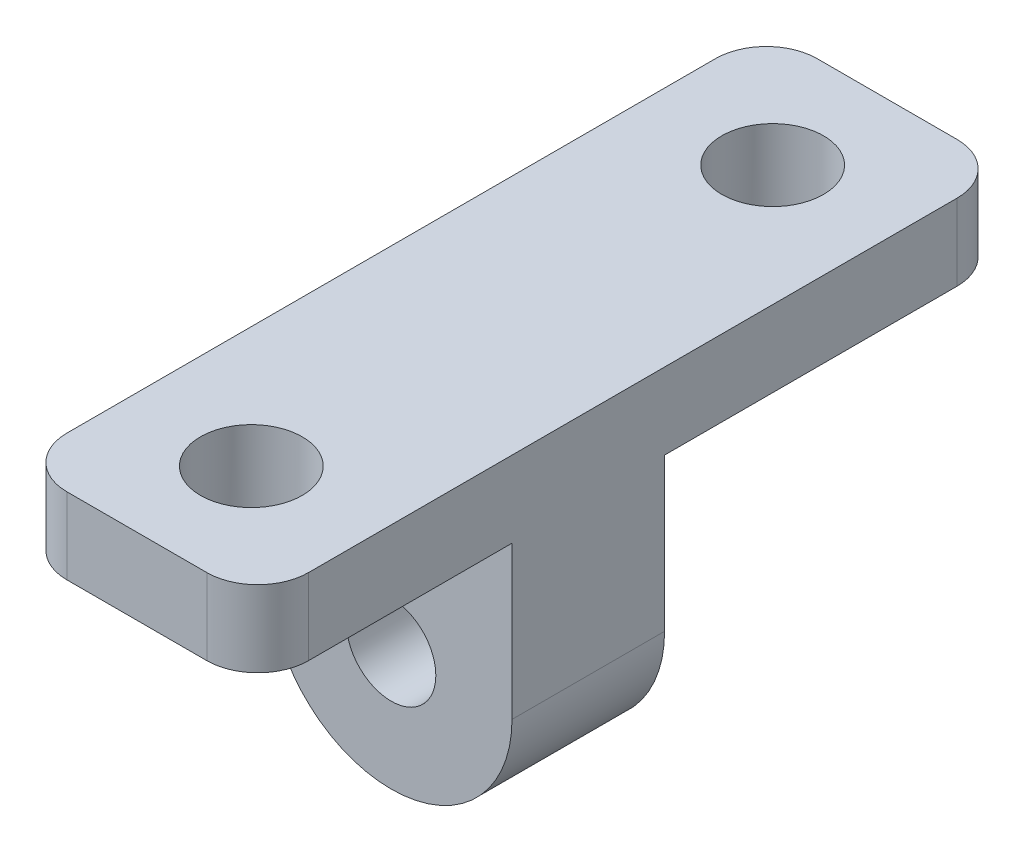
ISO-10303-21;
HEADER;
FILE_DESCRIPTION(('STEP AP214'),'2;1');
FILE_NAME('part.step','',(''),(''),'','','');
FILE_SCHEMA(('AUTOMOTIVE_DESIGN { 1 0 10303 214 1 1 1 1 }'));
ENDSEC;
DATA;
#1=APPLICATION_CONTEXT('core data for automotive mechanical design processes');
#2=APPLICATION_PROTOCOL_DEFINITION('international standard','automotive_design',2000,#1);
#3=PRODUCT_CONTEXT('',#1,'mechanical');
#4=PRODUCT('Part','Part','',(#3));
#5=PRODUCT_RELATED_PRODUCT_CATEGORY('part','',(#4));
#6=PRODUCT_DEFINITION_FORMATION('','',#4);
#7=PRODUCT_DEFINITION_CONTEXT('part definition',#1,'design');
#8=PRODUCT_DEFINITION('design','',#6,#7);
#9=PRODUCT_DEFINITION_SHAPE('','',#8);
#10=(LENGTH_UNIT() NAMED_UNIT(*) SI_UNIT(.MILLI.,.METRE.));
#11=(NAMED_UNIT(*) PLANE_ANGLE_UNIT() SI_UNIT($,.RADIAN.));
#12=(NAMED_UNIT(*) SI_UNIT($,.STERADIAN.) SOLID_ANGLE_UNIT());
#13=UNCERTAINTY_MEASURE_WITH_UNIT(LENGTH_MEASURE(1.E-05),#10,'distance_accuracy_value','');
#14=(GEOMETRIC_REPRESENTATION_CONTEXT(3) GLOBAL_UNCERTAINTY_ASSIGNED_CONTEXT((#13)) GLOBAL_UNIT_ASSIGNED_CONTEXT((#10,
#11,#12)) REPRESENTATION_CONTEXT('',''));
#15=CARTESIAN_POINT('',(0.,0.,0.));
#16=DIRECTION('',(0.,0.,1.));
#17=DIRECTION('',(1.,0.,0.));
#18=AXIS2_PLACEMENT_3D('',#15,#16,#17);
#19=CARTESIAN_POINT('',(0.,0.,6.));
#20=DIRECTION('',(0.,0.,-1.));
#21=DIRECTION('',(-1.,0.,0.));
#22=AXIS2_PLACEMENT_3D('',#19,#20,#21);
#23=CYLINDRICAL_SURFACE('',#22,4.75);
#24=CARTESIAN_POINT('',(0.,0.,0.));
#25=DIRECTION('',(0.,0.,1.));
#26=DIRECTION('',(1.,0.,0.));
#27=AXIS2_PLACEMENT_3D('',#24,#25,#26);
#28=CIRCLE('',#27,4.75);
#29=CARTESIAN_POINT('',(-4.75,0.,0.));
#30=VERTEX_POINT('',#29);
#31=CARTESIAN_POINT('',(4.75,0.,0.));
#32=VERTEX_POINT('',#31);
#33=EDGE_CURVE('E194',#30,#32,#28,.T.);
#34=ORIENTED_EDGE('',*,*,#33,.T.);
#35=DIRECTION('',(0.,0.,-1.));
#36=VECTOR('',#35,1.);
#37=CARTESIAN_POINT('',(4.75,0.,6.));
#38=LINE('',#37,#36);
#39=CARTESIAN_POINT('',(4.75,0.,6.));
#40=VERTEX_POINT('',#39);
#41=EDGE_CURVE('E212',#40,#32,#38,.T.);
#42=ORIENTED_EDGE('',*,*,#41,.F.);
#43=CARTESIAN_POINT('',(0.,0.,6.));
#44=DIRECTION('',(0.,0.,1.));
#45=DIRECTION('',(1.,0.,0.));
#46=AXIS2_PLACEMENT_3D('',#43,#44,#45);
#47=CIRCLE('',#46,4.75);
#48=CARTESIAN_POINT('',(-4.75,0.,6.));
#49=VERTEX_POINT('',#48);
#50=EDGE_CURVE('E142',#49,#40,#47,.T.);
#51=ORIENTED_EDGE('',*,*,#50,.F.);
#52=DIRECTION('',(0.,0.,-1.));
#53=VECTOR('',#52,1.);
#54=CARTESIAN_POINT('',(-4.75,0.,6.));
#55=LINE('',#54,#53);
#56=EDGE_CURVE('E189',#49,#30,#55,.T.);
#57=ORIENTED_EDGE('',*,*,#56,.T.);
#58=EDGE_LOOP('',(#34,#42,#51,#57));
#59=FACE_BOUND('',#58,.T.);
#60=ADVANCED_FACE('F47',(#59),#23,.T.);
#61=CARTESIAN_POINT('',(4.75,0.,6.));
#62=DIRECTION('',(1.,0.,0.));
#63=DIRECTION('',(0.,0.,-1.));
#64=AXIS2_PLACEMENT_3D('',#61,#62,#63);
#65=PLANE('',#64);
#66=DIRECTION('',(0.,0.,1.));
#67=VECTOR('',#66,1.);
#68=CARTESIAN_POINT('',(4.75,6.,-13.5));
#69=LINE('',#68,#67);
#70=CARTESIAN_POINT('',(4.75,6.,-11.5));
#71=VERTEX_POINT('',#70);
#72=CARTESIAN_POINT('',(4.75,6.,0.));
#73=VERTEX_POINT('',#72);
#74=EDGE_CURVE('E163',#71,#73,#69,.T.);
#75=ORIENTED_EDGE('',*,*,#74,.F.);
#76=DIRECTION('',(0.,-1.,0.));
#77=VECTOR('',#76,1.);
#78=CARTESIAN_POINT('',(4.75,0.,-11.5));
#79=LINE('',#78,#77);
#80=CARTESIAN_POINT('',(4.75,9.,-11.5));
#81=VERTEX_POINT('',#80);
#82=EDGE_CURVE('E235',#71,#81,#79,.F.);
#83=ORIENTED_EDGE('',*,*,#82,.T.);
#84=DIRECTION('',(0.,0.,1.));
#85=VECTOR('',#84,1.);
#86=CARTESIAN_POINT('',(4.75,9.,-13.5));
#87=LINE('',#86,#85);
#88=CARTESIAN_POINT('',(4.75,9.,14.));
#89=VERTEX_POINT('',#88);
#90=EDGE_CURVE('E269',#81,#89,#87,.T.);
#91=ORIENTED_EDGE('',*,*,#90,.T.);
#92=DIRECTION('',(0.,-1.,0.));
#93=VECTOR('',#92,1.);
#94=CARTESIAN_POINT('',(4.75,6.,14.));
#95=LINE('',#94,#93);
#96=CARTESIAN_POINT('',(4.75,6.,14.));
#97=VERTEX_POINT('',#96);
#98=EDGE_CURVE('E161',#89,#97,#95,.T.);
#99=ORIENTED_EDGE('',*,*,#98,.T.);
#100=CARTESIAN_POINT('',(4.75,6.,6.));
#101=VERTEX_POINT('',#100);
#102=EDGE_CURVE('E150',#101,#97,#69,.T.);
#103=ORIENTED_EDGE('',*,*,#102,.F.);
#104=DIRECTION('',(0.,-1.,0.));
#105=VECTOR('',#104,1.);
#106=CARTESIAN_POINT('',(4.75,0.,6.));
#107=LINE('',#106,#105);
#108=EDGE_CURVE('E135',#101,#40,#107,.T.);
#109=ORIENTED_EDGE('',*,*,#108,.T.);
#110=ORIENTED_EDGE('',*,*,#41,.T.);
#111=DIRECTION('',(0.,-1.,0.));
#112=VECTOR('',#111,1.);
#113=CARTESIAN_POINT('',(4.75,0.,0.));
#114=LINE('',#113,#112);
#115=EDGE_CURVE('E199',#73,#32,#114,.T.);
#116=ORIENTED_EDGE('',*,*,#115,.F.);
#117=EDGE_LOOP('',(#75,#83,#91,#99,#103,#109,#110,#116));
#118=FACE_BOUND('',#117,.T.);
#119=ADVANCED_FACE('F158',(#118),#65,.T.);
#120=CARTESIAN_POINT('',(0.,0.,6.));
#121=DIRECTION('',(0.,0.,-1.));
#122=DIRECTION('',(-1.,0.,0.));
#123=AXIS2_PLACEMENT_3D('',#120,#121,#122);
#124=CYLINDRICAL_SURFACE('',#123,1.755);
#125=CARTESIAN_POINT('',(0.,0.,6.));
#126=DIRECTION('',(0.,0.,1.));
#127=DIRECTION('',(1.,0.,0.));
#128=AXIS2_PLACEMENT_3D('',#125,#126,#127);
#129=CIRCLE('',#128,1.755);
#130=CARTESIAN_POINT('',(1.755,0.,6.));
#131=VERTEX_POINT('',#130);
#132=EDGE_CURVE('E180',#131,#131,#129,.T.);
#133=ORIENTED_EDGE('',*,*,#132,.T.);
#134=EDGE_LOOP('',(#133));
#135=FACE_BOUND('',#134,.T.);
#136=CARTESIAN_POINT('',(0.,0.,0.));
#137=DIRECTION('',(0.,0.,1.));
#138=DIRECTION('',(1.,0.,0.));
#139=AXIS2_PLACEMENT_3D('',#136,#137,#138);
#140=CIRCLE('',#139,1.755);
#141=CARTESIAN_POINT('',(1.755,0.,0.));
#142=VERTEX_POINT('',#141);
#143=EDGE_CURVE('E190',#142,#142,#140,.T.);
#144=ORIENTED_EDGE('',*,*,#143,.F.);
#145=EDGE_LOOP('',(#144));
#146=FACE_BOUND('',#145,.T.);
#147=ADVANCED_FACE('F320',(#135,#146),#124,.F.);
#148=CARTESIAN_POINT('',(-4.75,0.,6.));
#149=DIRECTION('',(-1.,0.,0.));
#150=DIRECTION('',(0.,0.,1.));
#151=AXIS2_PLACEMENT_3D('',#148,#149,#150);
#152=PLANE('',#151);
#153=DIRECTION('',(0.,0.,1.));
#154=VECTOR('',#153,1.);
#155=CARTESIAN_POINT('',(-4.75,9.,-13.5));
#156=LINE('',#155,#154);
#157=CARTESIAN_POINT('',(-4.75,9.,-11.5));
#158=VERTEX_POINT('',#157);
#159=CARTESIAN_POINT('',(-4.75,9.,14.));
#160=VERTEX_POINT('',#159);
#161=EDGE_CURVE('E195',#158,#160,#156,.T.);
#162=ORIENTED_EDGE('',*,*,#161,.F.);
#163=DIRECTION('',(0.,-1.,0.));
#164=VECTOR('',#163,1.);
#165=CARTESIAN_POINT('',(-4.75,0.,-11.5));
#166=LINE('',#165,#164);
#167=CARTESIAN_POINT('',(-4.75,6.,-11.5));
#168=VERTEX_POINT('',#167);
#169=EDGE_CURVE('E253',#158,#168,#166,.T.);
#170=ORIENTED_EDGE('',*,*,#169,.T.);
#171=DIRECTION('',(0.,0.,1.));
#172=VECTOR('',#171,1.);
#173=CARTESIAN_POINT('',(-4.75,6.,-13.5));
#174=LINE('',#173,#172);
#175=CARTESIAN_POINT('',(-4.75,6.,0.));
#176=VERTEX_POINT('',#175);
#177=EDGE_CURVE('E176',#168,#176,#174,.T.);
#178=ORIENTED_EDGE('',*,*,#177,.T.);
#179=DIRECTION('',(0.,1.,0.));
#180=VECTOR('',#179,1.);
#181=CARTESIAN_POINT('',(-4.75,0.,0.));
#182=LINE('',#181,#180);
#183=EDGE_CURVE('E184',#30,#176,#182,.T.);
#184=ORIENTED_EDGE('',*,*,#183,.F.);
#185=ORIENTED_EDGE('',*,*,#56,.F.);
#186=DIRECTION('',(0.,1.,0.));
#187=VECTOR('',#186,1.);
#188=CARTESIAN_POINT('',(-4.75,0.,6.));
#189=LINE('',#188,#187);
#190=CARTESIAN_POINT('',(-4.75,6.,6.));
#191=VERTEX_POINT('',#190);
#192=EDGE_CURVE('E154',#49,#191,#189,.T.);
#193=ORIENTED_EDGE('',*,*,#192,.T.);
#194=CARTESIAN_POINT('',(-4.75,6.,14.));
#195=VERTEX_POINT('',#194);
#196=EDGE_CURVE('E152',#191,#195,#174,.T.);
#197=ORIENTED_EDGE('',*,*,#196,.T.);
#198=DIRECTION('',(0.,-1.,0.));
#199=VECTOR('',#198,1.);
#200=CARTESIAN_POINT('',(-4.75,9.,14.));
#201=LINE('',#200,#199);
#202=EDGE_CURVE('E250',#195,#160,#201,.F.);
#203=ORIENTED_EDGE('',*,*,#202,.T.);
#204=EDGE_LOOP('',(#162,#170,#178,#184,#185,#193,#197,#203));
#205=FACE_BOUND('',#204,.T.);
#206=ADVANCED_FACE('F278',(#205),#152,.T.);
#207=CARTESIAN_POINT('',(0.,0.,6.));
#208=DIRECTION('',(0.,0.,1.));
#209=DIRECTION('',(1.,0.,0.));
#210=AXIS2_PLACEMENT_3D('',#207,#208,#209);
#211=PLANE('',#210);
#212=ORIENTED_EDGE('',*,*,#132,.F.);
#213=EDGE_LOOP('',(#212));
#214=FACE_BOUND('',#213,.T.);
#215=ORIENTED_EDGE('',*,*,#50,.T.);
#216=ORIENTED_EDGE('',*,*,#108,.F.);
#217=DIRECTION('',(1.,0.,0.));
#218=VECTOR('',#217,1.);
#219=CARTESIAN_POINT('',(0.,6.,6.));
#220=LINE('',#219,#218);
#221=EDGE_CURVE('E139',#191,#101,#220,.T.);
#222=ORIENTED_EDGE('',*,*,#221,.F.);
#223=ORIENTED_EDGE('',*,*,#192,.F.);
#224=EDGE_LOOP('',(#215,#216,#222,#223));
#225=FACE_BOUND('',#224,.T.);
#226=ADVANCED_FACE('F137',(#214,#225),#211,.T.);
#227=CARTESIAN_POINT('',(0.,0.,0.));
#228=DIRECTION('',(0.,0.,1.));
#229=DIRECTION('',(1.,0.,0.));
#230=AXIS2_PLACEMENT_3D('',#227,#228,#229);
#231=PLANE('',#230);
#232=ORIENTED_EDGE('',*,*,#143,.T.);
#233=EDGE_LOOP('',(#232));
#234=FACE_BOUND('',#233,.T.);
#235=ORIENTED_EDGE('',*,*,#33,.F.);
#236=ORIENTED_EDGE('',*,*,#183,.T.);
#237=DIRECTION('',(1.,0.,0.));
#238=VECTOR('',#237,1.);
#239=CARTESIAN_POINT('',(0.,6.,0.));
#240=LINE('',#239,#238);
#241=EDGE_CURVE('E203',#176,#73,#240,.T.);
#242=ORIENTED_EDGE('',*,*,#241,.T.);
#243=ORIENTED_EDGE('',*,*,#115,.T.);
#244=EDGE_LOOP('',(#235,#236,#242,#243));
#245=FACE_BOUND('',#244,.T.);
#246=ADVANCED_FACE('F312',(#234,#245),#231,.F.);
#247=CARTESIAN_POINT('',(0.,6.,0.));
#248=DIRECTION('',(0.,-1.,0.));
#249=DIRECTION('',(0.,0.,-1.));
#250=AXIS2_PLACEMENT_3D('',#247,#248,#249);
#251=PLANE('',#250);
#252=CARTESIAN_POINT('',(0.,6.,-9.));
#253=DIRECTION('',(0.,-1.,0.));
#254=DIRECTION('',(0.,0.,-1.));
#255=AXIS2_PLACEMENT_3D('',#252,#253,#254);
#256=CIRCLE('',#255,2.);
#257=CARTESIAN_POINT('',(0.,6.,-11.));
#258=VERTEX_POINT('',#257);
#259=EDGE_CURVE('E170',#258,#258,#256,.T.);
#260=ORIENTED_EDGE('',*,*,#259,.F.);
#261=EDGE_LOOP('',(#260));
#262=FACE_BOUND('',#261,.T.);
#263=DIRECTION('',(1.,0.,0.));
#264=VECTOR('',#263,1.);
#265=CARTESIAN_POINT('',(-4.75,6.,-13.5));
#266=LINE('',#265,#264);
#267=CARTESIAN_POINT('',(-2.75,6.,-13.5));
#268=VERTEX_POINT('',#267);
#269=CARTESIAN_POINT('',(2.75,6.,-13.5));
#270=VERTEX_POINT('',#269);
#271=EDGE_CURVE('E164',#268,#270,#266,.T.);
#272=ORIENTED_EDGE('',*,*,#271,.T.);
#273=CARTESIAN_POINT('',(2.75,6.,-11.5));
#274=DIRECTION('',(0.,-1.,0.));
#275=DIRECTION('',(0.,0.,-1.));
#276=AXIS2_PLACEMENT_3D('',#273,#274,#275);
#277=CIRCLE('',#276,2.);
#278=EDGE_CURVE('E230',#270,#71,#277,.T.);
#279=ORIENTED_EDGE('',*,*,#278,.T.);
#280=ORIENTED_EDGE('',*,*,#74,.T.);
#281=ORIENTED_EDGE('',*,*,#241,.F.);
#282=ORIENTED_EDGE('',*,*,#177,.F.);
#283=CARTESIAN_POINT('',(-2.75,6.,-11.5));
#284=DIRECTION('',(0.,-1.,0.));
#285=DIRECTION('',(0.,0.,-1.));
#286=AXIS2_PLACEMENT_3D('',#283,#284,#285);
#287=CIRCLE('',#286,2.);
#288=EDGE_CURVE('E227',#168,#268,#287,.T.);
#289=ORIENTED_EDGE('',*,*,#288,.T.);
#290=EDGE_LOOP('',(#272,#279,#280,#281,#282,#289));
#291=FACE_BOUND('',#290,.T.);
#292=ADVANCED_FACE('F309',(#262,#291),#251,.T.);
#293=CARTESIAN_POINT('',(-4.75,9.,-13.5));
#294=DIRECTION('',(0.,0.,-1.));
#295=DIRECTION('',(-1.,0.,0.));
#296=AXIS2_PLACEMENT_3D('',#293,#294,#295);
#297=PLANE('',#296);
#298=DIRECTION('',(1.,0.,0.));
#299=VECTOR('',#298,1.);
#300=CARTESIAN_POINT('',(-4.75,9.,-13.5));
#301=LINE('',#300,#299);
#302=CARTESIAN_POINT('',(-2.75,9.,-13.5));
#303=VERTEX_POINT('',#302);
#304=CARTESIAN_POINT('',(2.75,9.,-13.5));
#305=VERTEX_POINT('',#304);
#306=EDGE_CURVE('E179',#303,#305,#301,.T.);
#307=ORIENTED_EDGE('',*,*,#306,.T.);
#308=DIRECTION('',(0.,-1.,0.));
#309=VECTOR('',#308,1.);
#310=CARTESIAN_POINT('',(2.75,9.,-13.5));
#311=LINE('',#310,#309);
#312=EDGE_CURVE('E223',#305,#270,#311,.T.);
#313=ORIENTED_EDGE('',*,*,#312,.T.);
#314=ORIENTED_EDGE('',*,*,#271,.F.);
#315=DIRECTION('',(0.,-1.,0.));
#316=VECTOR('',#315,1.);
#317=CARTESIAN_POINT('',(-2.75,9.,-13.5));
#318=LINE('',#317,#316);
#319=EDGE_CURVE('E215',#268,#303,#318,.F.);
#320=ORIENTED_EDGE('',*,*,#319,.T.);
#321=EDGE_LOOP('',(#307,#313,#314,#320));
#322=FACE_BOUND('',#321,.T.);
#323=ADVANCED_FACE('F299',(#322),#297,.T.);
#324=CARTESIAN_POINT('',(-4.75,9.,16.));
#325=DIRECTION('',(0.,0.,-1.));
#326=DIRECTION('',(-1.,0.,0.));
#327=AXIS2_PLACEMENT_3D('',#324,#325,#326);
#328=PLANE('',#327);
#329=DIRECTION('',(1.,0.,0.));
#330=VECTOR('',#329,1.);
#331=CARTESIAN_POINT('',(-4.75,9.,16.));
#332=LINE('',#331,#330);
#333=CARTESIAN_POINT('',(-2.75,9.,16.));
#334=VERTEX_POINT('',#333);
#335=CARTESIAN_POINT('',(2.75,9.,16.));
#336=VERTEX_POINT('',#335);
#337=EDGE_CURVE('E266',#334,#336,#332,.T.);
#338=ORIENTED_EDGE('',*,*,#337,.F.);
#339=DIRECTION('',(0.,-1.,0.));
#340=VECTOR('',#339,1.);
#341=CARTESIAN_POINT('',(-2.75,6.,16.));
#342=LINE('',#341,#340);
#343=CARTESIAN_POINT('',(-2.75,6.,16.));
#344=VERTEX_POINT('',#343);
#345=EDGE_CURVE('E260',#334,#344,#342,.T.);
#346=ORIENTED_EDGE('',*,*,#345,.T.);
#347=DIRECTION('',(1.,0.,0.));
#348=VECTOR('',#347,1.);
#349=CARTESIAN_POINT('',(-4.75,6.,16.));
#350=LINE('',#349,#348);
#351=CARTESIAN_POINT('',(2.75,6.,16.));
#352=VERTEX_POINT('',#351);
#353=EDGE_CURVE('E168',#344,#352,#350,.T.);
#354=ORIENTED_EDGE('',*,*,#353,.T.);
#355=DIRECTION('',(0.,-1.,0.));
#356=VECTOR('',#355,1.);
#357=CARTESIAN_POINT('',(2.75,9.,16.));
#358=LINE('',#357,#356);
#359=EDGE_CURVE('E257',#352,#336,#358,.F.);
#360=ORIENTED_EDGE('',*,*,#359,.T.);
#361=EDGE_LOOP('',(#338,#346,#354,#360));
#362=FACE_BOUND('',#361,.T.);
#363=ADVANCED_FACE('F287',(#362),#328,.F.);
#364=CARTESIAN_POINT('',(0.,9.,0.));
#365=DIRECTION('',(0.,-1.,0.));
#366=DIRECTION('',(0.,0.,-1.));
#367=AXIS2_PLACEMENT_3D('',#364,#365,#366);
#368=PLANE('',#367);
#369=CARTESIAN_POINT('',(0.,9.,11.5));
#370=DIRECTION('',(0.,1.,0.));
#371=DIRECTION('',(0.,0.,1.));
#372=AXIS2_PLACEMENT_3D('',#369,#370,#371);
#373=CIRCLE('',#372,2.);
#374=CARTESIAN_POINT('',(0.,9.,13.5));
#375=VERTEX_POINT('',#374);
#376=EDGE_CURVE('E220',#375,#375,#373,.T.);
#377=ORIENTED_EDGE('',*,*,#376,.F.);
#378=EDGE_LOOP('',(#377));
#379=FACE_BOUND('',#378,.T.);
#380=CARTESIAN_POINT('',(0.,9.,-9.));
#381=DIRECTION('',(0.,1.,0.));
#382=DIRECTION('',(0.,0.,1.));
#383=AXIS2_PLACEMENT_3D('',#380,#381,#382);
#384=CIRCLE('',#383,2.);
#385=CARTESIAN_POINT('',(0.,9.,-7.));
#386=VERTEX_POINT('',#385);
#387=EDGE_CURVE('E484',#386,#386,#384,.T.);
#388=ORIENTED_EDGE('',*,*,#387,.F.);
#389=EDGE_LOOP('',(#388));
#390=FACE_BOUND('',#389,.T.);
#391=ORIENTED_EDGE('',*,*,#90,.F.);
#392=CARTESIAN_POINT('',(2.75,9.,-11.5));
#393=DIRECTION('',(0.,-1.,0.));
#394=DIRECTION('',(0.,0.,-1.));
#395=AXIS2_PLACEMENT_3D('',#392,#393,#394);
#396=CIRCLE('',#395,2.);
#397=EDGE_CURVE('E247',#81,#305,#396,.F.);
#398=ORIENTED_EDGE('',*,*,#397,.T.);
#399=ORIENTED_EDGE('',*,*,#306,.F.);
#400=CARTESIAN_POINT('',(-2.75,9.,-11.5));
#401=DIRECTION('',(0.,-1.,0.));
#402=DIRECTION('',(0.,0.,-1.));
#403=AXIS2_PLACEMENT_3D('',#400,#401,#402);
#404=CIRCLE('',#403,2.);
#405=EDGE_CURVE('E244',#303,#158,#404,.F.);
#406=ORIENTED_EDGE('',*,*,#405,.T.);
#407=ORIENTED_EDGE('',*,*,#161,.T.);
#408=CARTESIAN_POINT('',(-2.75,9.,14.));
#409=DIRECTION('',(0.,-1.,0.));
#410=DIRECTION('',(0.,0.,-1.));
#411=AXIS2_PLACEMENT_3D('',#408,#409,#410);
#412=CIRCLE('',#411,2.);
#413=EDGE_CURVE('E241',#160,#334,#412,.F.);
#414=ORIENTED_EDGE('',*,*,#413,.T.);
#415=ORIENTED_EDGE('',*,*,#337,.T.);
#416=CARTESIAN_POINT('',(2.75,9.,14.));
#417=DIRECTION('',(0.,-1.,0.));
#418=DIRECTION('',(0.,0.,-1.));
#419=AXIS2_PLACEMENT_3D('',#416,#417,#418);
#420=CIRCLE('',#419,2.);
#421=EDGE_CURVE('E238',#336,#89,#420,.F.);
#422=ORIENTED_EDGE('',*,*,#421,.T.);
#423=EDGE_LOOP('',(#391,#398,#399,#406,#407,#414,#415,#422));
#424=FACE_BOUND('',#423,.T.);
#425=ADVANCED_FACE('F284',(#379,#390,#424),#368,.F.);
#426=CARTESIAN_POINT('',(0.,6.,11.5));
#427=DIRECTION('',(0.,-1.,0.));
#428=DIRECTION('',(0.,0.,-1.));
#429=AXIS2_PLACEMENT_3D('',#426,#427,#428);
#430=CIRCLE('',#429,2.);
#431=CARTESIAN_POINT('',(0.,6.,9.5));
#432=VERTEX_POINT('',#431);
#433=EDGE_CURVE('E216',#432,#432,#430,.T.);
#434=ORIENTED_EDGE('',*,*,#433,.F.);
#435=EDGE_LOOP('',(#434));
#436=FACE_BOUND('',#435,.T.);
#437=ORIENTED_EDGE('',*,*,#353,.F.);
#438=CARTESIAN_POINT('',(-2.75,6.,14.));
#439=DIRECTION('',(0.,-1.,0.));
#440=DIRECTION('',(0.,0.,-1.));
#441=AXIS2_PLACEMENT_3D('',#438,#439,#440);
#442=CIRCLE('',#441,2.);
#443=EDGE_CURVE('E11',#344,#195,#442,.T.);
#444=ORIENTED_EDGE('',*,*,#443,.T.);
#445=ORIENTED_EDGE('',*,*,#196,.F.);
#446=ORIENTED_EDGE('',*,*,#221,.T.);
#447=ORIENTED_EDGE('',*,*,#102,.T.);
#448=CARTESIAN_POINT('',(2.75,6.,14.));
#449=DIRECTION('',(0.,-1.,0.));
#450=DIRECTION('',(0.,0.,-1.));
#451=AXIS2_PLACEMENT_3D('',#448,#449,#450);
#452=CIRCLE('',#451,2.);
#453=EDGE_CURVE('E56',#97,#352,#452,.T.);
#454=ORIENTED_EDGE('',*,*,#453,.T.);
#455=EDGE_LOOP('',(#437,#444,#445,#446,#447,#454));
#456=FACE_BOUND('',#455,.T.);
#457=ADVANCED_FACE('F149',(#436,#456),#251,.T.);
#458=CARTESIAN_POINT('',(0.,-4.75,11.5));
#459=DIRECTION('',(0.,1.,0.));
#460=DIRECTION('',(0.,0.,1.));
#461=AXIS2_PLACEMENT_3D('',#458,#459,#460);
#462=CYLINDRICAL_SURFACE('',#461,2.);
#463=ORIENTED_EDGE('',*,*,#433,.T.);
#464=EDGE_LOOP('',(#463));
#465=FACE_BOUND('',#464,.T.);
#466=ORIENTED_EDGE('',*,*,#376,.T.);
#467=EDGE_LOOP('',(#466));
#468=FACE_BOUND('',#467,.T.);
#469=ADVANCED_FACE('F363',(#465,#468),#462,.F.);
#470=CARTESIAN_POINT('',(0.,-4.75,-9.));
#471=DIRECTION('',(0.,1.,0.));
#472=DIRECTION('',(0.,0.,1.));
#473=AXIS2_PLACEMENT_3D('',#470,#471,#472);
#474=CYLINDRICAL_SURFACE('',#473,2.);
#475=ORIENTED_EDGE('',*,*,#259,.T.);
#476=EDGE_LOOP('',(#475));
#477=FACE_BOUND('',#476,.T.);
#478=ORIENTED_EDGE('',*,*,#387,.T.);
#479=EDGE_LOOP('',(#478));
#480=FACE_BOUND('',#479,.T.);
#481=ADVANCED_FACE('F328',(#477,#480),#474,.F.);
#482=CARTESIAN_POINT('',(2.75,9.,-11.5));
#483=DIRECTION('',(0.,-1.,0.));
#484=DIRECTION('',(0.,0.,-1.));
#485=AXIS2_PLACEMENT_3D('',#482,#483,#484);
#486=CYLINDRICAL_SURFACE('',#485,2.);
#487=ORIENTED_EDGE('',*,*,#397,.F.);
#488=ORIENTED_EDGE('',*,*,#82,.F.);
#489=ORIENTED_EDGE('',*,*,#278,.F.);
#490=ORIENTED_EDGE('',*,*,#312,.F.);
#491=EDGE_LOOP('',(#487,#488,#489,#490));
#492=FACE_BOUND('',#491,.T.);
#493=ADVANCED_FACE('F294',(#492),#486,.T.);
#494=CARTESIAN_POINT('',(-2.75,0.,-11.5));
#495=DIRECTION('',(0.,-1.,0.));
#496=DIRECTION('',(0.,0.,-1.));
#497=AXIS2_PLACEMENT_3D('',#494,#495,#496);
#498=CYLINDRICAL_SURFACE('',#497,2.);
#499=ORIENTED_EDGE('',*,*,#405,.F.);
#500=ORIENTED_EDGE('',*,*,#319,.F.);
#501=ORIENTED_EDGE('',*,*,#288,.F.);
#502=ORIENTED_EDGE('',*,*,#169,.F.);
#503=EDGE_LOOP('',(#499,#500,#501,#502));
#504=FACE_BOUND('',#503,.T.);
#505=ADVANCED_FACE('F303',(#504),#498,.T.);
#506=CARTESIAN_POINT('',(-2.75,9.,14.));
#507=DIRECTION('',(0.,1.,0.));
#508=DIRECTION('',(0.,0.,1.));
#509=AXIS2_PLACEMENT_3D('',#506,#507,#508);
#510=CYLINDRICAL_SURFACE('',#509,2.);
#511=ORIENTED_EDGE('',*,*,#413,.F.);
#512=ORIENTED_EDGE('',*,*,#202,.F.);
#513=ORIENTED_EDGE('',*,*,#443,.F.);
#514=ORIENTED_EDGE('',*,*,#345,.F.);
#515=EDGE_LOOP('',(#511,#512,#513,#514));
#516=FACE_BOUND('',#515,.T.);
#517=ADVANCED_FACE('F280',(#516),#510,.T.);
#518=CARTESIAN_POINT('',(2.75,0.,14.));
#519=DIRECTION('',(0.,1.,0.));
#520=DIRECTION('',(0.,0.,1.));
#521=AXIS2_PLACEMENT_3D('',#518,#519,#520);
#522=CYLINDRICAL_SURFACE('',#521,2.);
#523=ORIENTED_EDGE('',*,*,#421,.F.);
#524=ORIENTED_EDGE('',*,*,#359,.F.);
#525=ORIENTED_EDGE('',*,*,#453,.F.);
#526=ORIENTED_EDGE('',*,*,#98,.F.);
#527=EDGE_LOOP('',(#523,#524,#525,#526));
#528=FACE_BOUND('',#527,.T.);
#529=ADVANCED_FACE('F49',(#528),#522,.T.);
#530=CLOSED_SHELL('',(#60,#119,#147,#206,#226,#246,#292,#323,#363,#425,#457,#469,#481,#493,#505,
#517,#529));
#531=MANIFOLD_SOLID_BREP('B2',#530);
#532=ADVANCED_BREP_SHAPE_REPRESENTATION('',(#18,#531),#14);
#533=SHAPE_DEFINITION_REPRESENTATION(#9,#532);
ENDSEC;
END-ISO-10303-21;
